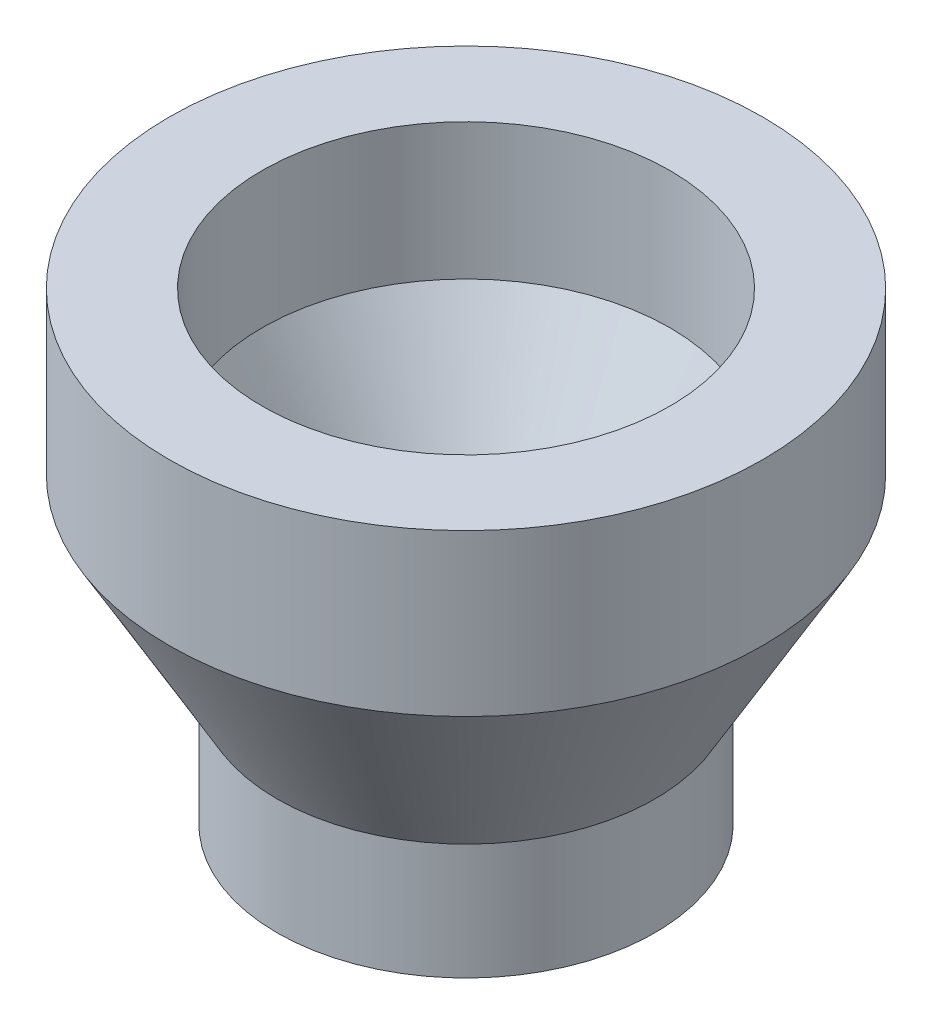
ISO-10303-21;
HEADER;
FILE_DESCRIPTION(('STEP AP214'),'2;1');
FILE_NAME('part.step','',(''),(''),'','','');
FILE_SCHEMA(('AUTOMOTIVE_DESIGN { 1 0 10303 214 1 1 1 1 }'));
ENDSEC;
DATA;
#1=APPLICATION_CONTEXT('core data for automotive mechanical design processes');
#2=APPLICATION_PROTOCOL_DEFINITION('international standard','automotive_design',2000,#1);
#3=PRODUCT_CONTEXT('',#1,'mechanical');
#4=PRODUCT('Part','Part','',(#3));
#5=PRODUCT_RELATED_PRODUCT_CATEGORY('part','',(#4));
#6=PRODUCT_DEFINITION_FORMATION('','',#4);
#7=PRODUCT_DEFINITION_CONTEXT('part definition',#1,'design');
#8=PRODUCT_DEFINITION('design','',#6,#7);
#9=PRODUCT_DEFINITION_SHAPE('','',#8);
#10=(LENGTH_UNIT() NAMED_UNIT(*) SI_UNIT(.MILLI.,.METRE.));
#11=(NAMED_UNIT(*) PLANE_ANGLE_UNIT() SI_UNIT($,.RADIAN.));
#12=(NAMED_UNIT(*) SI_UNIT($,.STERADIAN.) SOLID_ANGLE_UNIT());
#13=UNCERTAINTY_MEASURE_WITH_UNIT(LENGTH_MEASURE(1.E-05),#10,'distance_accuracy_value','');
#14=(GEOMETRIC_REPRESENTATION_CONTEXT(3) GLOBAL_UNCERTAINTY_ASSIGNED_CONTEXT((#13)) GLOBAL_UNIT_ASSIGNED_CONTEXT((#10,
#11,#12)) REPRESENTATION_CONTEXT('',''));
#15=CARTESIAN_POINT('',(0.,0.,0.));
#16=DIRECTION('',(0.,0.,1.));
#17=DIRECTION('',(1.,0.,0.));
#18=AXIS2_PLACEMENT_3D('',#15,#16,#17);
#19=CARTESIAN_POINT('',(-2.575,22.,0.));
#20=DIRECTION('',(0.,1.,0.));
#21=DIRECTION('',(0.,0.,1.));
#22=AXIS2_PLACEMENT_3D('',#19,#20,#21);
#23=PLANE('',#22);
#24=CARTESIAN_POINT('',(0.,22.,0.));
#25=DIRECTION('',(0.,-1.,0.));
#26=DIRECTION('',(0.,0.,-1.));
#27=AXIS2_PLACEMENT_3D('',#24,#25,#26);
#28=CIRCLE('',#27,2.575);
#29=CARTESIAN_POINT('',(0.,22.,-2.575));
#30=VERTEX_POINT('',#29);
#31=EDGE_CURVE('E61',#30,#30,#28,.T.);
#32=ORIENTED_EDGE('',*,*,#31,.F.);
#33=EDGE_LOOP('',(#32));
#34=FACE_BOUND('',#33,.T.);
#35=CARTESIAN_POINT('',(0.,22.,0.));
#36=DIRECTION('',(0.,-1.,0.));
#37=DIRECTION('',(0.,0.,-1.));
#38=AXIS2_PLACEMENT_3D('',#35,#36,#37);
#39=CIRCLE('',#38,4.075);
#40=CARTESIAN_POINT('',(0.,22.,-4.075));
#41=VERTEX_POINT('',#40);
#42=EDGE_CURVE('E10',#41,#41,#39,.T.);
#43=ORIENTED_EDGE('',*,*,#42,.T.);
#44=EDGE_LOOP('',(#43));
#45=FACE_BOUND('',#44,.T.);
#46=ADVANCED_FACE('F33',(#34,#45),#23,.F.);
#47=CARTESIAN_POINT('',(0.,0.,0.));
#48=DIRECTION('',(0.,-1.,0.));
#49=DIRECTION('',(0.,0.,-1.));
#50=AXIS2_PLACEMENT_3D('',#47,#48,#49);
#51=CYLINDRICAL_SURFACE('',#50,4.075);
#52=ORIENTED_EDGE('',*,*,#42,.F.);
#53=EDGE_LOOP('',(#52));
#54=FACE_BOUND('',#53,.T.);
#55=CARTESIAN_POINT('',(0.,24.5,0.));
#56=DIRECTION('',(0.,-1.,0.));
#57=DIRECTION('',(0.,0.,-1.));
#58=AXIS2_PLACEMENT_3D('',#55,#56,#57);
#59=CIRCLE('',#58,4.075);
#60=CARTESIAN_POINT('',(0.,24.5,-4.075));
#61=VERTEX_POINT('',#60);
#62=EDGE_CURVE('E39',#61,#61,#59,.T.);
#63=ORIENTED_EDGE('',*,*,#62,.T.);
#64=EDGE_LOOP('',(#63));
#65=FACE_BOUND('',#64,.T.);
#66=ADVANCED_FACE('F68',(#54,#65),#51,.T.);
#67=CARTESIAN_POINT('',(0.,28.5270181275976,0.));
#68=DIRECTION('',(0.,1.,0.));
#69=DIRECTION('',(0.,0.,1.));
#70=AXIS2_PLACEMENT_3D('',#67,#68,#69);
#71=CONICAL_SURFACE('',#70,6.4,0.5235987755983);
#72=ORIENTED_EDGE('',*,*,#62,.F.);
#73=EDGE_LOOP('',(#72));
#74=FACE_BOUND('',#73,.T.);
#75=CARTESIAN_POINT('',(0.,28.5270181275976,0.));
#76=DIRECTION('',(0.,-1.,0.));
#77=DIRECTION('',(0.,0.,-1.));
#78=AXIS2_PLACEMENT_3D('',#75,#76,#77);
#79=CIRCLE('',#78,6.4);
#80=CARTESIAN_POINT('',(0.,28.5270181275976,-6.4));
#81=VERTEX_POINT('',#80);
#82=EDGE_CURVE('E43',#81,#81,#79,.T.);
#83=ORIENTED_EDGE('',*,*,#82,.T.);
#84=EDGE_LOOP('',(#83));
#85=FACE_BOUND('',#84,.T.);
#86=ADVANCED_FACE('F72',(#74,#85),#71,.T.);
#87=CARTESIAN_POINT('',(0.,0.,0.));
#88=DIRECTION('',(0.,-1.,0.));
#89=DIRECTION('',(0.,0.,-1.));
#90=AXIS2_PLACEMENT_3D('',#87,#88,#89);
#91=CYLINDRICAL_SURFACE('',#90,6.4);
#92=ORIENTED_EDGE('',*,*,#82,.F.);
#93=EDGE_LOOP('',(#92));
#94=FACE_BOUND('',#93,.T.);
#95=CARTESIAN_POINT('',(0.,32.,0.));
#96=DIRECTION('',(0.,-1.,0.));
#97=DIRECTION('',(0.,0.,-1.));
#98=AXIS2_PLACEMENT_3D('',#95,#96,#97);
#99=CIRCLE('',#98,6.4);
#100=CARTESIAN_POINT('',(0.,32.,-6.4));
#101=VERTEX_POINT('',#100);
#102=EDGE_CURVE('E47',#101,#101,#99,.T.);
#103=ORIENTED_EDGE('',*,*,#102,.T.);
#104=EDGE_LOOP('',(#103));
#105=FACE_BOUND('',#104,.T.);
#106=ADVANCED_FACE('F77',(#94,#105),#91,.T.);
#107=CARTESIAN_POINT('',(-6.4,32.,0.));
#108=DIRECTION('',(0.,-1.,0.));
#109=DIRECTION('',(0.,0.,-1.));
#110=AXIS2_PLACEMENT_3D('',#107,#108,#109);
#111=PLANE('',#110);
#112=ORIENTED_EDGE('',*,*,#102,.F.);
#113=EDGE_LOOP('',(#112));
#114=FACE_BOUND('',#113,.T.);
#115=CARTESIAN_POINT('',(0.,32.,0.));
#116=DIRECTION('',(0.,-1.,0.));
#117=DIRECTION('',(0.,0.,-1.));
#118=AXIS2_PLACEMENT_3D('',#115,#116,#117);
#119=CIRCLE('',#118,4.4);
#120=CARTESIAN_POINT('',(0.,32.,-4.4));
#121=VERTEX_POINT('',#120);
#122=EDGE_CURVE('E52',#121,#121,#119,.T.);
#123=ORIENTED_EDGE('',*,*,#122,.T.);
#124=EDGE_LOOP('',(#123));
#125=FACE_BOUND('',#124,.T.);
#126=ADVANCED_FACE('F83',(#114,#125),#111,.F.);
#127=CARTESIAN_POINT('',(0.,0.,0.));
#128=DIRECTION('',(0.,-1.,0.));
#129=DIRECTION('',(0.,0.,-1.));
#130=AXIS2_PLACEMENT_3D('',#127,#128,#129);
#131=CYLINDRICAL_SURFACE('',#130,4.4);
#132=ORIENTED_EDGE('',*,*,#122,.F.);
#133=EDGE_LOOP('',(#132));
#134=FACE_BOUND('',#133,.T.);
#135=CARTESIAN_POINT('',(0.,29.0629165124599,0.));
#136=DIRECTION('',(0.,-1.,0.));
#137=DIRECTION('',(0.,0.,-1.));
#138=AXIS2_PLACEMENT_3D('',#135,#136,#137);
#139=CIRCLE('',#138,4.4);
#140=CARTESIAN_POINT('',(0.,29.0629165124599,-4.4));
#141=VERTEX_POINT('',#140);
#142=EDGE_CURVE('E55',#141,#141,#139,.T.);
#143=ORIENTED_EDGE('',*,*,#142,.T.);
#144=EDGE_LOOP('',(#143));
#145=FACE_BOUND('',#144,.T.);
#146=ADVANCED_FACE('F87',(#134,#145),#131,.F.);
#147=CARTESIAN_POINT('',(0.,25.9019237886467,0.));
#148=DIRECTION('',(0.,1.,0.));
#149=DIRECTION('',(0.,0.,1.));
#150=AXIS2_PLACEMENT_3D('',#147,#148,#149);
#151=CONICAL_SURFACE('',#150,2.575,0.523598775598301);
#152=ORIENTED_EDGE('',*,*,#142,.F.);
#153=EDGE_LOOP('',(#152));
#154=FACE_BOUND('',#153,.T.);
#155=CARTESIAN_POINT('',(0.,25.9019237886467,0.));
#156=DIRECTION('',(0.,-1.,0.));
#157=DIRECTION('',(0.,0.,-1.));
#158=AXIS2_PLACEMENT_3D('',#155,#156,#157);
#159=CIRCLE('',#158,2.575);
#160=CARTESIAN_POINT('',(0.,25.9019237886467,-2.575));
#161=VERTEX_POINT('',#160);
#162=EDGE_CURVE('E58',#161,#161,#159,.T.);
#163=ORIENTED_EDGE('',*,*,#162,.T.);
#164=EDGE_LOOP('',(#163));
#165=FACE_BOUND('',#164,.T.);
#166=ADVANCED_FACE('F91',(#154,#165),#151,.F.);
#167=CARTESIAN_POINT('',(0.,0.,0.));
#168=DIRECTION('',(0.,-1.,0.));
#169=DIRECTION('',(0.,0.,-1.));
#170=AXIS2_PLACEMENT_3D('',#167,#168,#169);
#171=CYLINDRICAL_SURFACE('',#170,2.575);
#172=ORIENTED_EDGE('',*,*,#162,.F.);
#173=EDGE_LOOP('',(#172));
#174=FACE_BOUND('',#173,.T.);
#175=ORIENTED_EDGE('',*,*,#31,.T.);
#176=EDGE_LOOP('',(#175));
#177=FACE_BOUND('',#176,.T.);
#178=ADVANCED_FACE('F65',(#174,#177),#171,.F.);
#179=CLOSED_SHELL('',(#46,#66,#86,#106,#126,#146,#166,#178));
#180=MANIFOLD_SOLID_BREP('B2',#179);
#181=ADVANCED_BREP_SHAPE_REPRESENTATION('',(#18,#180),#14);
#182=SHAPE_DEFINITION_REPRESENTATION(#9,#181);
ENDSEC;
END-ISO-10303-21;
